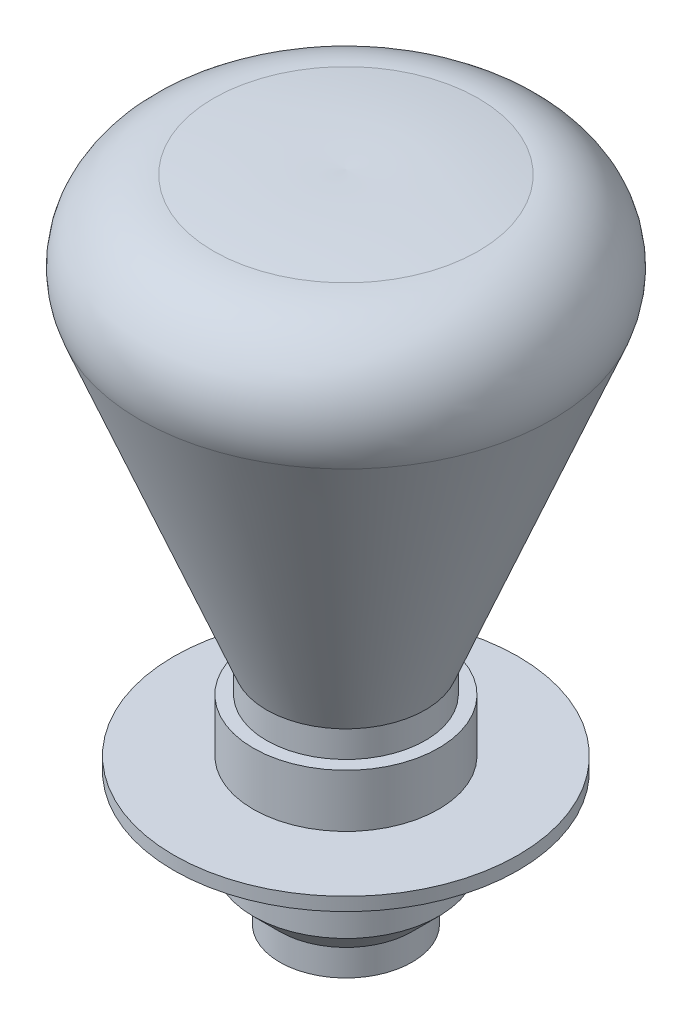
ISO-10303-21;
HEADER;
FILE_DESCRIPTION(('STEP AP214'),'2;1');
FILE_NAME('part.step','',(''),(''),'','','');
FILE_SCHEMA(('AUTOMOTIVE_DESIGN { 1 0 10303 214 1 1 1 1 }'));
ENDSEC;
DATA;
#1=APPLICATION_CONTEXT('core data for automotive mechanical design processes');
#2=APPLICATION_PROTOCOL_DEFINITION('international standard','automotive_design',2000,#1);
#3=PRODUCT_CONTEXT('',#1,'mechanical');
#4=PRODUCT('Part','Part','',(#3));
#5=PRODUCT_RELATED_PRODUCT_CATEGORY('part','',(#4));
#6=PRODUCT_DEFINITION_FORMATION('','',#4);
#7=PRODUCT_DEFINITION_CONTEXT('part definition',#1,'design');
#8=PRODUCT_DEFINITION('design','',#6,#7);
#9=PRODUCT_DEFINITION_SHAPE('','',#8);
#10=(LENGTH_UNIT() NAMED_UNIT(*) SI_UNIT(.MILLI.,.METRE.));
#11=(NAMED_UNIT(*) PLANE_ANGLE_UNIT() SI_UNIT($,.RADIAN.));
#12=(NAMED_UNIT(*) SI_UNIT($,.STERADIAN.) SOLID_ANGLE_UNIT());
#13=UNCERTAINTY_MEASURE_WITH_UNIT(LENGTH_MEASURE(1.E-05),#10,'distance_accuracy_value','');
#14=(GEOMETRIC_REPRESENTATION_CONTEXT(3) GLOBAL_UNCERTAINTY_ASSIGNED_CONTEXT((#13)) GLOBAL_UNIT_ASSIGNED_CONTEXT((#10,
#11,#12)) REPRESENTATION_CONTEXT('',''));
#15=CARTESIAN_POINT('',(0.,0.,0.));
#16=DIRECTION('',(0.,0.,1.));
#17=DIRECTION('',(1.,0.,0.));
#18=AXIS2_PLACEMENT_3D('',#15,#16,#17);
#19=CARTESIAN_POINT('',(1.5,-4.65968272784195,1.50000000000002));
#20=DIRECTION('',(-1.,0.,0.));
#21=DIRECTION('',(0.,0.,1.));
#22=AXIS2_PLACEMENT_3D('',#19,#20,#21);
#23=CIRCLE('',#22,28.04);
#24=TRIMMED_CURVE('',#23,(PARAMETER_VALUE(-1.62431688142503)),
(PARAMETER_VALUE(1.62431688142503)),.T.,.PARAMETER.);
#25=CARTESIAN_POINT('',(1.5,-4.65968272784195,0.));
#26=DIRECTION('',(0.,1.,0.));
#27=AXIS1_PLACEMENT('',#25,#26);
#28=SURFACE_OF_REVOLUTION('',#24,#27);
#29=CARTESIAN_POINT('',(1.5,23.3401672717563,0.));
#30=VERTEX_POINT('',#29);
#31=VERTEX_LOOP('',#30);
#32=FACE_BOUND('',#31,.T.);
#33=CARTESIAN_POINT('',(1.5,23.1610217923531,0.));
#34=DIRECTION('',(0.,1.,0.));
#35=DIRECTION('',(0.,0.,1.));
#36=AXIS2_PLACEMENT_3D('',#33,#34,#35);
#37=CIRCLE('',#36,5.);
#38=CARTESIAN_POINT('',(1.5,23.1610217923531,5.));
#39=VERTEX_POINT('',#38);
#40=EDGE_CURVE('E11',#39,#39,#37,.T.);
#41=ORIENTED_EDGE('',*,*,#40,.T.);
#42=EDGE_LOOP('',(#41));
#43=FACE_BOUND('',#42,.T.);
#44=ADVANCED_FACE('F41',(#32,#43),#28,.T.);
#45=CARTESIAN_POINT('',(1.5,20.1610217923531,0.));
#46=DIRECTION('',(0.,1.,0.));
#47=DIRECTION('',(0.,0.,1.));
#48=AXIS2_PLACEMENT_3D('',#45,#46,#47);
#49=TOROIDAL_SURFACE('',#48,5.,3.);
#50=ORIENTED_EDGE('',*,*,#40,.F.);
#51=EDGE_LOOP('',(#50));
#52=FACE_BOUND('',#51,.T.);
#53=CARTESIAN_POINT('',(1.5,19.0405738683693,0.));
#54=DIRECTION('',(0.,1.,0.));
#55=DIRECTION('',(0.,0.,1.));
#56=AXIS2_PLACEMENT_3D('',#53,#54,#55);
#57=CIRCLE('',#56,7.78291150589458);
#58=CARTESIAN_POINT('',(1.5,19.0405738683693,7.78291150589458));
#59=VERTEX_POINT('',#58);
#60=EDGE_CURVE('E47',#59,#59,#57,.T.);
#61=ORIENTED_EDGE('',*,*,#60,.T.);
#62=EDGE_LOOP('',(#61));
#63=FACE_BOUND('',#62,.T.);
#64=ADVANCED_FACE('F52',(#52,#63),#49,.T.);
#65=CARTESIAN_POINT('',(1.5,7.16102179235308,0.));
#66=DIRECTION('',(0.,1.,0.));
#67=DIRECTION('',(0.,0.,1.));
#68=AXIS2_PLACEMENT_3D('',#65,#66,#67);
#69=CONICAL_SURFACE('',#68,3.,0.382760510475255);
#70=ORIENTED_EDGE('',*,*,#60,.F.);
#71=EDGE_LOOP('',(#70));
#72=FACE_BOUND('',#71,.T.);
#73=CARTESIAN_POINT('',(1.5,7.16102179235308,0.));
#74=DIRECTION('',(0.,1.,0.));
#75=DIRECTION('',(0.,0.,1.));
#76=AXIS2_PLACEMENT_3D('',#73,#74,#75);
#77=CIRCLE('',#76,3.);
#78=CARTESIAN_POINT('',(1.5,7.16102179235308,3.));
#79=VERTEX_POINT('',#78);
#80=EDGE_CURVE('E61',#79,#79,#77,.T.);
#81=ORIENTED_EDGE('',*,*,#80,.T.);
#82=EDGE_LOOP('',(#81));
#83=FACE_BOUND('',#82,.T.);
#84=ADVANCED_FACE('F57',(#72,#83),#69,.T.);
#85=CARTESIAN_POINT('',(1.5,32.4036143040685,0.));
#86=DIRECTION('',(0.,1.,0.));
#87=DIRECTION('',(0.,0.,1.));
#88=AXIS2_PLACEMENT_3D('',#85,#86,#87);
#89=CYLINDRICAL_SURFACE('',#88,3.);
#90=ORIENTED_EDGE('',*,*,#80,.F.);
#91=EDGE_LOOP('',(#90));
#92=FACE_BOUND('',#91,.T.);
#93=CARTESIAN_POINT('',(1.5,6.16102179235307,0.));
#94=DIRECTION('',(0.,1.,0.));
#95=DIRECTION('',(0.,0.,1.));
#96=AXIS2_PLACEMENT_3D('',#93,#94,#95);
#97=CIRCLE('',#96,3.);
#98=CARTESIAN_POINT('',(1.5,6.16102179235307,3.));
#99=VERTEX_POINT('',#98);
#100=EDGE_CURVE('E63',#99,#99,#97,.T.);
#101=ORIENTED_EDGE('',*,*,#100,.T.);
#102=EDGE_LOOP('',(#101));
#103=FACE_BOUND('',#102,.T.);
#104=ADVANCED_FACE('F131',(#92,#103),#89,.T.);
#105=CARTESIAN_POINT('',(0.,6.16102179235307,0.));
#106=DIRECTION('',(0.,-1.,0.));
#107=DIRECTION('',(0.,0.,-1.));
#108=AXIS2_PLACEMENT_3D('',#105,#106,#107);
#109=PLANE('',#108);
#110=ORIENTED_EDGE('',*,*,#100,.F.);
#111=EDGE_LOOP('',(#110));
#112=FACE_BOUND('',#111,.T.);
#113=CARTESIAN_POINT('',(1.5,6.16102179235307,0.));
#114=DIRECTION('',(0.,1.,0.));
#115=DIRECTION('',(0.,0.,1.));
#116=AXIS2_PLACEMENT_3D('',#113,#114,#115);
#117=CIRCLE('',#116,3.5);
#118=CARTESIAN_POINT('',(1.5,6.16102179235307,3.5));
#119=VERTEX_POINT('',#118);
#120=EDGE_CURVE('E68',#119,#119,#117,.T.);
#121=ORIENTED_EDGE('',*,*,#120,.T.);
#122=EDGE_LOOP('',(#121));
#123=FACE_BOUND('',#122,.T.);
#124=ADVANCED_FACE('F127',(#112,#123),#109,.F.);
#125=CARTESIAN_POINT('',(1.5,32.4036143040685,0.));
#126=DIRECTION('',(0.,1.,0.));
#127=DIRECTION('',(0.,0.,1.));
#128=AXIS2_PLACEMENT_3D('',#125,#126,#127);
#129=CYLINDRICAL_SURFACE('',#128,3.5);
#130=ORIENTED_EDGE('',*,*,#120,.F.);
#131=EDGE_LOOP('',(#130));
#132=FACE_BOUND('',#131,.T.);
#133=CARTESIAN_POINT('',(1.5,4.16102179235307,0.));
#134=DIRECTION('',(0.,1.,0.));
#135=DIRECTION('',(0.,0.,1.));
#136=AXIS2_PLACEMENT_3D('',#133,#134,#135);
#137=CIRCLE('',#136,3.5);
#138=CARTESIAN_POINT('',(1.5,4.16102179235307,3.5));
#139=VERTEX_POINT('',#138);
#140=EDGE_CURVE('E71',#139,#139,#137,.T.);
#141=ORIENTED_EDGE('',*,*,#140,.T.);
#142=EDGE_LOOP('',(#141));
#143=FACE_BOUND('',#142,.T.);
#144=ADVANCED_FACE('F123',(#132,#143),#129,.T.);
#145=CARTESIAN_POINT('',(0.,4.16102179235307,0.));
#146=DIRECTION('',(0.,-1.,0.));
#147=DIRECTION('',(0.,0.,-1.));
#148=AXIS2_PLACEMENT_3D('',#145,#146,#147);
#149=PLANE('',#148);
#150=ORIENTED_EDGE('',*,*,#140,.F.);
#151=EDGE_LOOP('',(#150));
#152=FACE_BOUND('',#151,.T.);
#153=CARTESIAN_POINT('',(1.5,4.16102179235307,0.));
#154=DIRECTION('',(0.,1.,0.));
#155=DIRECTION('',(0.,0.,1.));
#156=AXIS2_PLACEMENT_3D('',#153,#154,#155);
#157=CIRCLE('',#156,6.5);
#158=CARTESIAN_POINT('',(1.5,4.16102179235307,6.5));
#159=VERTEX_POINT('',#158);
#160=EDGE_CURVE('E74',#159,#159,#157,.T.);
#161=ORIENTED_EDGE('',*,*,#160,.T.);
#162=EDGE_LOOP('',(#161));
#163=FACE_BOUND('',#162,.T.);
#164=ADVANCED_FACE('F119',(#152,#163),#149,.F.);
#165=CARTESIAN_POINT('',(1.5,32.4036143040685,0.));
#166=DIRECTION('',(0.,1.,0.));
#167=DIRECTION('',(0.,0.,1.));
#168=AXIS2_PLACEMENT_3D('',#165,#166,#167);
#169=CYLINDRICAL_SURFACE('',#168,6.5);
#170=ORIENTED_EDGE('',*,*,#160,.F.);
#171=EDGE_LOOP('',(#170));
#172=FACE_BOUND('',#171,.T.);
#173=CARTESIAN_POINT('',(1.5,3.66102179235308,0.));
#174=DIRECTION('',(0.,1.,0.));
#175=DIRECTION('',(0.,0.,1.));
#176=AXIS2_PLACEMENT_3D('',#173,#174,#175);
#177=CIRCLE('',#176,6.5);
#178=CARTESIAN_POINT('',(1.5,3.66102179235308,6.5));
#179=VERTEX_POINT('',#178);
#180=EDGE_CURVE('E77',#179,#179,#177,.T.);
#181=ORIENTED_EDGE('',*,*,#180,.T.);
#182=EDGE_LOOP('',(#181));
#183=FACE_BOUND('',#182,.T.);
#184=ADVANCED_FACE('F115',(#172,#183),#169,.T.);
#185=CARTESIAN_POINT('',(0.,3.66102179235307,0.));
#186=DIRECTION('',(0.,-1.,0.));
#187=DIRECTION('',(0.,0.,-1.));
#188=AXIS2_PLACEMENT_3D('',#185,#186,#187);
#189=PLANE('',#188);
#190=CARTESIAN_POINT('',(1.5,3.66102179235308,0.));
#191=DIRECTION('',(0.,1.,0.));
#192=DIRECTION('',(0.,0.,1.));
#193=AXIS2_PLACEMENT_3D('',#190,#191,#192);
#194=CIRCLE('',#193,3.5);
#195=CARTESIAN_POINT('',(1.5,3.66102179235308,3.5));
#196=VERTEX_POINT('',#195);
#197=EDGE_CURVE('E80',#196,#196,#194,.T.);
#198=ORIENTED_EDGE('',*,*,#197,.T.);
#199=EDGE_LOOP('',(#198));
#200=FACE_BOUND('',#199,.T.);
#201=ORIENTED_EDGE('',*,*,#180,.F.);
#202=EDGE_LOOP('',(#201));
#203=FACE_BOUND('',#202,.T.);
#204=ADVANCED_FACE('F111',(#200,#203),#189,.T.);
#205=CARTESIAN_POINT('',(1.5,32.4036143040685,0.));
#206=DIRECTION('',(0.,1.,0.));
#207=DIRECTION('',(0.,0.,1.));
#208=AXIS2_PLACEMENT_3D('',#205,#206,#207);
#209=CYLINDRICAL_SURFACE('',#208,3.5);
#210=ORIENTED_EDGE('',*,*,#197,.F.);
#211=EDGE_LOOP('',(#210));
#212=FACE_BOUND('',#211,.T.);
#213=CARTESIAN_POINT('',(1.5,0.661021792353084,0.));
#214=DIRECTION('',(0.,1.,0.));
#215=DIRECTION('',(0.,0.,1.));
#216=AXIS2_PLACEMENT_3D('',#213,#214,#215);
#217=CIRCLE('',#216,3.5);
#218=CARTESIAN_POINT('',(1.5,0.661021792353084,3.5));
#219=VERTEX_POINT('',#218);
#220=EDGE_CURVE('E83',#219,#219,#217,.T.);
#221=ORIENTED_EDGE('',*,*,#220,.T.);
#222=EDGE_LOOP('',(#221));
#223=FACE_BOUND('',#222,.T.);
#224=ADVANCED_FACE('F107',(#212,#223),#209,.T.);
#225=CARTESIAN_POINT('',(1.5,-0.338978207646917,0.));
#226=DIRECTION('',(0.,1.,0.));
#227=DIRECTION('',(0.,0.,1.));
#228=AXIS2_PLACEMENT_3D('',#225,#226,#227);
#229=CONICAL_SURFACE('',#228,2.5,0.785398163397449);
#230=ORIENTED_EDGE('',*,*,#220,.F.);
#231=EDGE_LOOP('',(#230));
#232=FACE_BOUND('',#231,.T.);
#233=CARTESIAN_POINT('',(1.5,-0.338978207646917,0.));
#234=DIRECTION('',(0.,1.,0.));
#235=DIRECTION('',(0.,0.,1.));
#236=AXIS2_PLACEMENT_3D('',#233,#234,#235);
#237=CIRCLE('',#236,2.5);
#238=CARTESIAN_POINT('',(1.5,-0.338978207646917,2.5));
#239=VERTEX_POINT('',#238);
#240=EDGE_CURVE('E86',#239,#239,#237,.T.);
#241=ORIENTED_EDGE('',*,*,#240,.T.);
#242=EDGE_LOOP('',(#241));
#243=FACE_BOUND('',#242,.T.);
#244=ADVANCED_FACE('F102',(#232,#243),#229,.T.);
#245=CARTESIAN_POINT('',(1.5,32.4036143040685,0.));
#246=DIRECTION('',(0.,1.,0.));
#247=DIRECTION('',(0.,0.,1.));
#248=AXIS2_PLACEMENT_3D('',#245,#246,#247);
#249=CYLINDRICAL_SURFACE('',#248,2.5);
#250=CARTESIAN_POINT('',(1.5,-1.33897820764692,0.));
#251=DIRECTION('',(0.,1.,0.));
#252=DIRECTION('',(0.,0.,1.));
#253=AXIS2_PLACEMENT_3D('',#250,#251,#252);
#254=CIRCLE('',#253,2.5);
#255=CARTESIAN_POINT('',(1.5,-1.33897820764692,2.5));
#256=VERTEX_POINT('',#255);
#257=EDGE_CURVE('E89',#256,#256,#254,.T.);
#258=ORIENTED_EDGE('',*,*,#257,.T.);
#259=EDGE_LOOP('',(#258));
#260=FACE_BOUND('',#259,.T.);
#261=ORIENTED_EDGE('',*,*,#240,.F.);
#262=EDGE_LOOP('',(#261));
#263=FACE_BOUND('',#262,.T.);
#264=ADVANCED_FACE('F93',(#260,#263),#249,.T.);
#265=CARTESIAN_POINT('',(0.,-1.33897820764692,0.));
#266=DIRECTION('',(0.,-1.,0.));
#267=DIRECTION('',(0.,0.,-1.));
#268=AXIS2_PLACEMENT_3D('',#265,#266,#267);
#269=PLANE('',#268);
#270=ORIENTED_EDGE('',*,*,#257,.F.);
#271=EDGE_LOOP('',(#270));
#272=FACE_BOUND('',#271,.T.);
#273=ADVANCED_FACE('F96',(#272),#269,.T.);
#274=CLOSED_SHELL('',(#44,#64,#84,#104,#124,#144,#164,#184,#204,#224,#244,#264,#273));
#275=MANIFOLD_SOLID_BREP('B2',#274);
#276=ADVANCED_BREP_SHAPE_REPRESENTATION('',(#18,#275),#14);
#277=SHAPE_DEFINITION_REPRESENTATION(#9,#276);
ENDSEC;
END-ISO-10303-21;
